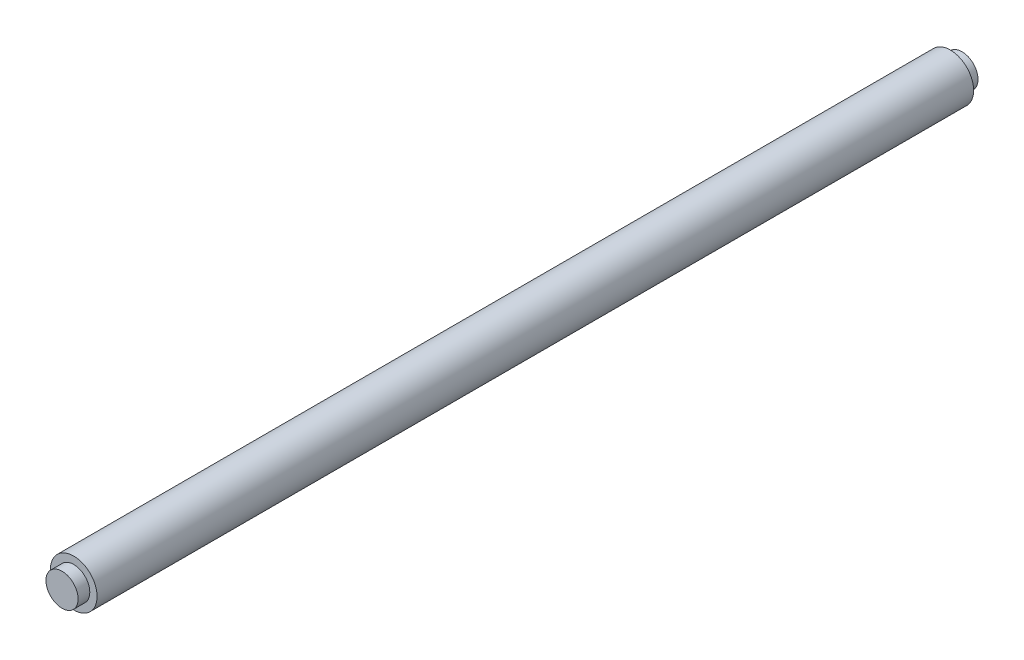
ISO-10303-21;
HEADER;
FILE_DESCRIPTION(('STEP AP214'),'2;1');
FILE_NAME('part.step','',(''),(''),'','','');
FILE_SCHEMA(('AUTOMOTIVE_DESIGN { 1 0 10303 214 1 1 1 1 }'));
ENDSEC;
DATA;
#1=APPLICATION_CONTEXT('core data for automotive mechanical design processes');
#2=APPLICATION_PROTOCOL_DEFINITION('international standard','automotive_design',2000,#1);
#3=PRODUCT_CONTEXT('',#1,'mechanical');
#4=PRODUCT('Part','Part','',(#3));
#5=PRODUCT_RELATED_PRODUCT_CATEGORY('part','',(#4));
#6=PRODUCT_DEFINITION_FORMATION('','',#4);
#7=PRODUCT_DEFINITION_CONTEXT('part definition',#1,'design');
#8=PRODUCT_DEFINITION('design','',#6,#7);
#9=PRODUCT_DEFINITION_SHAPE('','',#8);
#10=(LENGTH_UNIT() NAMED_UNIT(*) SI_UNIT(.MILLI.,.METRE.));
#11=(NAMED_UNIT(*) PLANE_ANGLE_UNIT() SI_UNIT($,.RADIAN.));
#12=(NAMED_UNIT(*) SI_UNIT($,.STERADIAN.) SOLID_ANGLE_UNIT());
#13=UNCERTAINTY_MEASURE_WITH_UNIT(LENGTH_MEASURE(1.E-05),#10,'distance_accuracy_value','');
#14=(GEOMETRIC_REPRESENTATION_CONTEXT(3) GLOBAL_UNCERTAINTY_ASSIGNED_CONTEXT((#13)) GLOBAL_UNIT_ASSIGNED_CONTEXT((#10,
#11,#12)) REPRESENTATION_CONTEXT('',''));
#15=CARTESIAN_POINT('',(0.,0.,0.));
#16=DIRECTION('',(0.,0.,1.));
#17=DIRECTION('',(1.,0.,0.));
#18=AXIS2_PLACEMENT_3D('',#15,#16,#17);
#19=CARTESIAN_POINT('',(0.,0.,75.));
#20=DIRECTION('',(0.,0.,-1.));
#21=DIRECTION('',(-1.,0.,0.));
#22=AXIS2_PLACEMENT_3D('',#19,#20,#21);
#23=CYLINDRICAL_SURFACE('',#22,2.);
#24=CARTESIAN_POINT('',(0.,0.,75.));
#25=DIRECTION('',(0.,0.,1.));
#26=DIRECTION('',(1.,0.,0.));
#27=AXIS2_PLACEMENT_3D('',#24,#25,#26);
#28=CIRCLE('',#27,2.);
#29=CARTESIAN_POINT('',(2.,0.,75.));
#30=VERTEX_POINT('',#29);
#31=EDGE_CURVE('E47',#30,#30,#28,.T.);
#32=ORIENTED_EDGE('',*,*,#31,.F.);
#33=EDGE_LOOP('',(#32));
#34=FACE_BOUND('',#33,.T.);
#35=CARTESIAN_POINT('',(0.,0.,0.));
#36=DIRECTION('',(0.,0.,1.));
#37=DIRECTION('',(1.,0.,0.));
#38=AXIS2_PLACEMENT_3D('',#35,#36,#37);
#39=CIRCLE('',#38,2.);
#40=CARTESIAN_POINT('',(2.,0.,0.));
#41=VERTEX_POINT('',#40);
#42=EDGE_CURVE('E38',#41,#41,#39,.T.);
#43=ORIENTED_EDGE('',*,*,#42,.T.);
#44=EDGE_LOOP('',(#43));
#45=FACE_BOUND('',#44,.T.);
#46=ADVANCED_FACE('F35',(#34,#45),#23,.T.);
#47=CARTESIAN_POINT('',(0.,0.,75.));
#48=DIRECTION('',(0.,0.,1.));
#49=DIRECTION('',(1.,0.,0.));
#50=AXIS2_PLACEMENT_3D('',#47,#48,#49);
#51=PLANE('',#50);
#52=CARTESIAN_POINT('',(0.,0.,75.));
#53=DIRECTION('',(0.,0.,1.));
#54=DIRECTION('',(1.,0.,0.));
#55=AXIS2_PLACEMENT_3D('',#52,#53,#54);
#56=CIRCLE('',#55,1.375);
#57=CARTESIAN_POINT('',(1.375,0.,75.));
#58=VERTEX_POINT('',#57);
#59=EDGE_CURVE('E42',#58,#58,#56,.T.);
#60=ORIENTED_EDGE('',*,*,#59,.F.);
#61=EDGE_LOOP('',(#60));
#62=FACE_BOUND('',#61,.T.);
#63=ORIENTED_EDGE('',*,*,#31,.T.);
#64=EDGE_LOOP('',(#63));
#65=FACE_BOUND('',#64,.T.);
#66=ADVANCED_FACE('F64',(#62,#65),#51,.T.);
#67=CARTESIAN_POINT('',(0.,0.,0.));
#68=DIRECTION('',(0.,0.,1.));
#69=DIRECTION('',(1.,0.,0.));
#70=AXIS2_PLACEMENT_3D('',#67,#68,#69);
#71=PLANE('',#70);
#72=CARTESIAN_POINT('',(0.,0.,0.));
#73=DIRECTION('',(0.,0.,-1.));
#74=DIRECTION('',(-1.,0.,0.));
#75=AXIS2_PLACEMENT_3D('',#72,#73,#74);
#76=CIRCLE('',#75,1.375);
#77=CARTESIAN_POINT('',(-1.375,0.,0.));
#78=VERTEX_POINT('',#77);
#79=EDGE_CURVE('E10',#78,#78,#76,.T.);
#80=ORIENTED_EDGE('',*,*,#79,.F.);
#81=EDGE_LOOP('',(#80));
#82=FACE_BOUND('',#81,.T.);
#83=ORIENTED_EDGE('',*,*,#42,.F.);
#84=EDGE_LOOP('',(#83));
#85=FACE_BOUND('',#84,.T.);
#86=ADVANCED_FACE('F61',(#82,#85),#71,.F.);
#87=CARTESIAN_POINT('',(0.,0.,76.));
#88=DIRECTION('',(0.,0.,-1.));
#89=DIRECTION('',(-1.,0.,0.));
#90=AXIS2_PLACEMENT_3D('',#87,#88,#89);
#91=CYLINDRICAL_SURFACE('',#90,1.375);
#92=CARTESIAN_POINT('',(0.,0.,76.));
#93=DIRECTION('',(0.,0.,1.));
#94=DIRECTION('',(1.,0.,0.));
#95=AXIS2_PLACEMENT_3D('',#92,#93,#94);
#96=CIRCLE('',#95,1.375);
#97=CARTESIAN_POINT('',(1.375,0.,76.));
#98=VERTEX_POINT('',#97);
#99=EDGE_CURVE('E52',#98,#98,#96,.T.);
#100=ORIENTED_EDGE('',*,*,#99,.F.);
#101=EDGE_LOOP('',(#100));
#102=FACE_BOUND('',#101,.T.);
#103=ORIENTED_EDGE('',*,*,#59,.T.);
#104=EDGE_LOOP('',(#103));
#105=FACE_BOUND('',#104,.T.);
#106=ADVANCED_FACE('F63',(#102,#105),#91,.T.);
#107=CARTESIAN_POINT('',(0.,0.,76.));
#108=DIRECTION('',(0.,0.,1.));
#109=DIRECTION('',(1.,0.,0.));
#110=AXIS2_PLACEMENT_3D('',#107,#108,#109);
#111=PLANE('',#110);
#112=ORIENTED_EDGE('',*,*,#99,.T.);
#113=EDGE_LOOP('',(#112));
#114=FACE_BOUND('',#113,.T.);
#115=ADVANCED_FACE('F70',(#114),#111,.T.);
#116=CARTESIAN_POINT('',(0.,0.,-1.));
#117=DIRECTION('',(0.,0.,1.));
#118=DIRECTION('',(1.,0.,0.));
#119=AXIS2_PLACEMENT_3D('',#116,#117,#118);
#120=CYLINDRICAL_SURFACE('',#119,1.375);
#121=CARTESIAN_POINT('',(0.,0.,-1.));
#122=DIRECTION('',(0.,0.,-1.));
#123=DIRECTION('',(-1.,0.,0.));
#124=AXIS2_PLACEMENT_3D('',#121,#122,#123);
#125=CIRCLE('',#124,1.375);
#126=CARTESIAN_POINT('',(-1.375,0.,-1.));
#127=VERTEX_POINT('',#126);
#128=EDGE_CURVE('E51',#127,#127,#125,.T.);
#129=ORIENTED_EDGE('',*,*,#128,.F.);
#130=EDGE_LOOP('',(#129));
#131=FACE_BOUND('',#130,.T.);
#132=ORIENTED_EDGE('',*,*,#79,.T.);
#133=EDGE_LOOP('',(#132));
#134=FACE_BOUND('',#133,.T.);
#135=ADVANCED_FACE('F100',(#131,#134),#120,.T.);
#136=CARTESIAN_POINT('',(0.,0.,-1.));
#137=DIRECTION('',(0.,0.,-1.));
#138=DIRECTION('',(-1.,0.,0.));
#139=AXIS2_PLACEMENT_3D('',#136,#137,#138);
#140=PLANE('',#139);
#141=ORIENTED_EDGE('',*,*,#128,.T.);
#142=EDGE_LOOP('',(#141));
#143=FACE_BOUND('',#142,.T.);
#144=ADVANCED_FACE('F116',(#143),#140,.T.);
#145=CLOSED_SHELL('',(#46,#66,#86,#106,#115,#135,#144));
#146=MANIFOLD_SOLID_BREP('B2',#145);
#147=ADVANCED_BREP_SHAPE_REPRESENTATION('',(#18,#146),#14);
#148=SHAPE_DEFINITION_REPRESENTATION(#9,#147);
ENDSEC;
END-ISO-10303-21;
